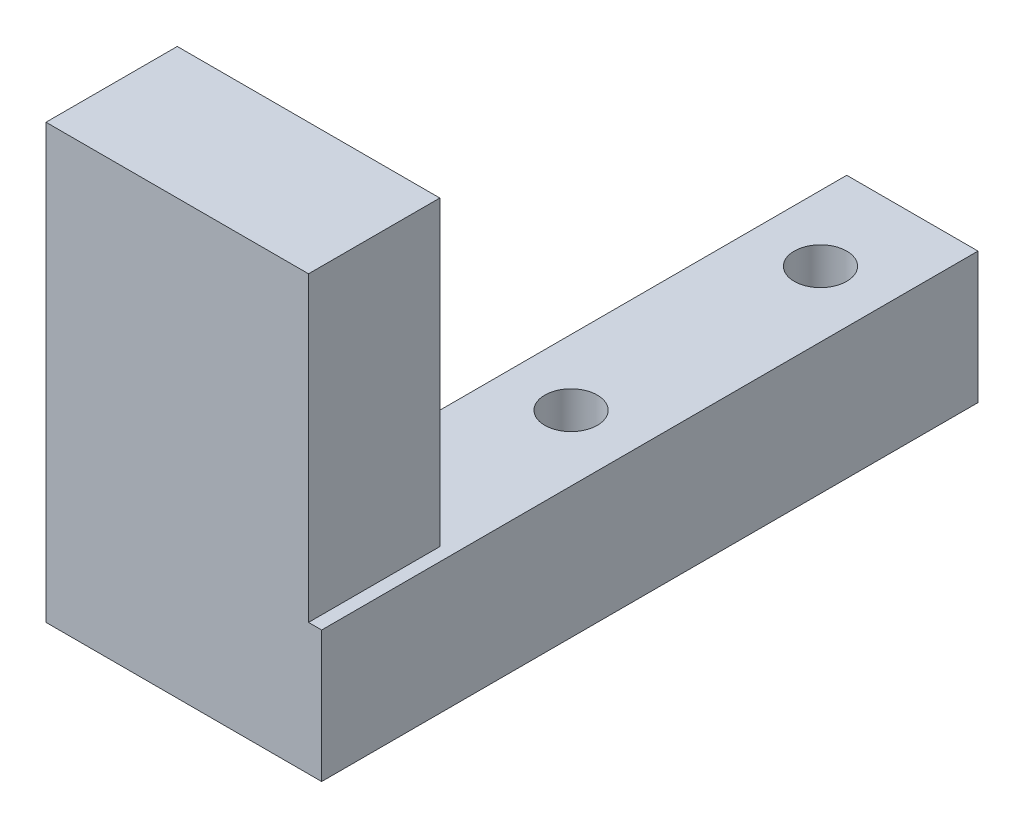
ISO-10303-21;
HEADER;
FILE_DESCRIPTION(('STEP AP214'),'2;1');
FILE_NAME('part.step','',(''),(''),'','','');
FILE_SCHEMA(('AUTOMOTIVE_DESIGN { 1 0 10303 214 1 1 1 1 }'));
ENDSEC;
DATA;
#1=APPLICATION_CONTEXT('core data for automotive mechanical design processes');
#2=APPLICATION_PROTOCOL_DEFINITION('international standard','automotive_design',2000,#1);
#3=PRODUCT_CONTEXT('',#1,'mechanical');
#4=PRODUCT('Part','Part','',(#3));
#5=PRODUCT_RELATED_PRODUCT_CATEGORY('part','',(#4));
#6=PRODUCT_DEFINITION_FORMATION('','',#4);
#7=PRODUCT_DEFINITION_CONTEXT('part definition',#1,'design');
#8=PRODUCT_DEFINITION('design','',#6,#7);
#9=PRODUCT_DEFINITION_SHAPE('','',#8);
#10=(LENGTH_UNIT() NAMED_UNIT(*) SI_UNIT(.MILLI.,.METRE.));
#11=(NAMED_UNIT(*) PLANE_ANGLE_UNIT() SI_UNIT($,.RADIAN.));
#12=(NAMED_UNIT(*) SI_UNIT($,.STERADIAN.) SOLID_ANGLE_UNIT());
#13=UNCERTAINTY_MEASURE_WITH_UNIT(LENGTH_MEASURE(1.E-05),#10,'distance_accuracy_value','');
#14=(GEOMETRIC_REPRESENTATION_CONTEXT(3) GLOBAL_UNCERTAINTY_ASSIGNED_CONTEXT((#13)) GLOBAL_UNIT_ASSIGNED_CONTEXT((#10,
#11,#12)) REPRESENTATION_CONTEXT('',''));
#15=CARTESIAN_POINT('',(0.,0.,0.));
#16=DIRECTION('',(0.,0.,1.));
#17=DIRECTION('',(1.,0.,0.));
#18=AXIS2_PLACEMENT_3D('',#15,#16,#17);
#19=CARTESIAN_POINT('',(-7.85128298838194,3.64329268292683,50.));
#20=DIRECTION('',(0.,-1.,0.));
#21=DIRECTION('',(0.,0.,-1.));
#22=AXIS2_PLACEMENT_3D('',#19,#20,#21);
#23=PLANE('',#22);
#24=CARTESIAN_POINT('',(-2.85128298838193,3.64329268292683,26.));
#25=DIRECTION('',(0.,1.,0.));
#26=DIRECTION('',(0.,0.,1.));
#27=AXIS2_PLACEMENT_3D('',#24,#25,#26);
#28=CIRCLE('',#27,2.);
#29=CARTESIAN_POINT('',(-2.85128298838193,3.64329268292683,28.));
#30=VERTEX_POINT('',#29);
#31=EDGE_CURVE('E207',#30,#30,#28,.T.);
#32=ORIENTED_EDGE('',*,*,#31,.F.);
#33=EDGE_LOOP('',(#32));
#34=FACE_BOUND('',#33,.T.);
#35=CARTESIAN_POINT('',(-2.85128298838194,3.64329268292683,7.));
#36=DIRECTION('',(0.,1.,0.));
#37=DIRECTION('',(0.,0.,1.));
#38=AXIS2_PLACEMENT_3D('',#35,#36,#37);
#39=CIRCLE('',#38,2.);
#40=CARTESIAN_POINT('',(-2.85128298838194,3.64329268292683,9.));
#41=VERTEX_POINT('',#40);
#42=EDGE_CURVE('E130',#41,#41,#39,.T.);
#43=ORIENTED_EDGE('',*,*,#42,.F.);
#44=EDGE_LOOP('',(#43));
#45=FACE_BOUND('',#44,.T.);
#46=DIRECTION('',(-1.,0.,0.));
#47=VECTOR('',#46,1.);
#48=CARTESIAN_POINT('',(-18.8512829883819,3.64329268292683,40.));
#49=LINE('',#48,#47);
#50=CARTESIAN_POINT('',(1.14871701161806,3.64329268292683,40.));
#51=VERTEX_POINT('',#50);
#52=CARTESIAN_POINT('',(-7.85128298838194,3.64329268292683,40.));
#53=VERTEX_POINT('',#52);
#54=EDGE_CURVE('E125',#51,#53,#49,.T.);
#55=ORIENTED_EDGE('',*,*,#54,.F.);
#56=DIRECTION('',(0.,0.,-1.));
#57=VECTOR('',#56,1.);
#58=CARTESIAN_POINT('',(1.14871701161806,3.64329268292683,50.));
#59=LINE('',#58,#57);
#60=CARTESIAN_POINT('',(1.14871701161806,3.64329268292683,50.));
#61=VERTEX_POINT('',#60);
#62=EDGE_CURVE('E51',#61,#51,#59,.T.);
#63=ORIENTED_EDGE('',*,*,#62,.F.);
#64=DIRECTION('',(-1.,0.,0.));
#65=VECTOR('',#64,1.);
#66=CARTESIAN_POINT('',(-7.85128298838194,3.64329268292683,50.));
#67=LINE('',#66,#65);
#68=CARTESIAN_POINT('',(2.14871701161806,3.64329268292683,50.));
#69=VERTEX_POINT('',#68);
#70=EDGE_CURVE('E156',#69,#61,#67,.T.);
#71=ORIENTED_EDGE('',*,*,#70,.F.);
#72=DIRECTION('',(0.,0.,-1.));
#73=VECTOR('',#72,1.);
#74=CARTESIAN_POINT('',(2.14871701161806,3.64329268292683,50.));
#75=LINE('',#74,#73);
#76=CARTESIAN_POINT('',(2.14871701161806,3.64329268292683,0.));
#77=VERTEX_POINT('',#76);
#78=EDGE_CURVE('E173',#69,#77,#75,.T.);
#79=ORIENTED_EDGE('',*,*,#78,.T.);
#80=DIRECTION('',(-1.,0.,0.));
#81=VECTOR('',#80,1.);
#82=CARTESIAN_POINT('',(-7.85128298838194,3.64329268292683,0.));
#83=LINE('',#82,#81);
#84=CARTESIAN_POINT('',(-7.85128298838194,3.64329268292683,0.));
#85=VERTEX_POINT('',#84);
#86=EDGE_CURVE('E169',#77,#85,#83,.T.);
#87=ORIENTED_EDGE('',*,*,#86,.T.);
#88=DIRECTION('',(0.,0.,-1.));
#89=VECTOR('',#88,1.);
#90=CARTESIAN_POINT('',(-7.85128298838194,3.64329268292683,50.));
#91=LINE('',#90,#89);
#92=EDGE_CURVE('E149',#53,#85,#91,.T.);
#93=ORIENTED_EDGE('',*,*,#92,.F.);
#94=EDGE_LOOP('',(#55,#63,#71,#79,#87,#93));
#95=FACE_BOUND('',#94,.T.);
#96=ADVANCED_FACE('F34',(#34,#45,#95),#23,.F.);
#97=CARTESIAN_POINT('',(-7.85128298838194,3.64329268292683,50.));
#98=DIRECTION('',(1.,0.,0.));
#99=DIRECTION('',(0.,1.,0.));
#100=AXIS2_PLACEMENT_3D('',#97,#98,#99);
#101=PLANE('',#100);
#102=DIRECTION('',(0.,-1.,0.));
#103=VECTOR('',#102,1.);
#104=CARTESIAN_POINT('',(-7.85128298838194,3.64329268292683,40.));
#105=LINE('',#104,#103);
#106=CARTESIAN_POINT('',(-7.85128298838193,-6.35670731707317,40.));
#107=VERTEX_POINT('',#106);
#108=EDGE_CURVE('E59',#53,#107,#105,.T.);
#109=ORIENTED_EDGE('',*,*,#108,.F.);
#110=ORIENTED_EDGE('',*,*,#92,.T.);
#111=DIRECTION('',(0.,-1.,0.));
#112=VECTOR('',#111,1.);
#113=CARTESIAN_POINT('',(-7.85128298838194,3.64329268292683,0.));
#114=LINE('',#113,#112);
#115=CARTESIAN_POINT('',(-7.85128298838193,-6.35670731707317,0.));
#116=VERTEX_POINT('',#115);
#117=EDGE_CURVE('E153',#85,#116,#114,.T.);
#118=ORIENTED_EDGE('',*,*,#117,.T.);
#119=DIRECTION('',(0.,0.,-1.));
#120=VECTOR('',#119,1.);
#121=CARTESIAN_POINT('',(-7.85128298838193,-6.35670731707317,50.));
#122=LINE('',#121,#120);
#123=EDGE_CURVE('E11',#107,#116,#122,.T.);
#124=ORIENTED_EDGE('',*,*,#123,.F.);
#125=EDGE_LOOP('',(#109,#110,#118,#124));
#126=FACE_BOUND('',#125,.T.);
#127=ADVANCED_FACE('F36',(#126),#101,.F.);
#128=CARTESIAN_POINT('',(-7.85128298838193,-6.35670731707317,50.));
#129=DIRECTION('',(0.,1.,0.));
#130=DIRECTION('',(0.,0.,1.));
#131=AXIS2_PLACEMENT_3D('',#128,#129,#130);
#132=PLANE('',#131);
#133=CARTESIAN_POINT('',(-2.85128298838193,-6.35670731707317,26.));
#134=DIRECTION('',(0.,1.,0.));
#135=DIRECTION('',(0.,0.,1.));
#136=AXIS2_PLACEMENT_3D('',#133,#134,#135);
#137=CIRCLE('',#136,2.);
#138=CARTESIAN_POINT('',(-2.85128298838193,-6.35670731707317,28.));
#139=VERTEX_POINT('',#138);
#140=EDGE_CURVE('E38',#139,#139,#137,.T.);
#141=ORIENTED_EDGE('',*,*,#140,.T.);
#142=EDGE_LOOP('',(#141));
#143=FACE_BOUND('',#142,.T.);
#144=CARTESIAN_POINT('',(-2.85128298838194,-6.35670731707317,7.));
#145=DIRECTION('',(0.,1.,0.));
#146=DIRECTION('',(0.,0.,1.));
#147=AXIS2_PLACEMENT_3D('',#144,#145,#146);
#148=CIRCLE('',#147,2.);
#149=CARTESIAN_POINT('',(-2.85128298838194,-6.35670731707317,9.));
#150=VERTEX_POINT('',#149);
#151=EDGE_CURVE('E199',#150,#150,#148,.T.);
#152=ORIENTED_EDGE('',*,*,#151,.T.);
#153=EDGE_LOOP('',(#152));
#154=FACE_BOUND('',#153,.T.);
#155=DIRECTION('',(1.,0.,0.));
#156=VECTOR('',#155,1.);
#157=CARTESIAN_POINT('',(-7.85128298838193,-6.35670731707317,0.));
#158=LINE('',#157,#156);
#159=CARTESIAN_POINT('',(2.14871701161806,-6.35670731707317,0.));
#160=VERTEX_POINT('',#159);
#161=EDGE_CURVE('E165',#116,#160,#158,.T.);
#162=ORIENTED_EDGE('',*,*,#161,.T.);
#163=DIRECTION('',(0.,0.,-1.));
#164=VECTOR('',#163,1.);
#165=CARTESIAN_POINT('',(2.14871701161806,-6.35670731707317,50.));
#166=LINE('',#165,#164);
#167=CARTESIAN_POINT('',(2.14871701161806,-6.35670731707317,50.));
#168=VERTEX_POINT('',#167);
#169=EDGE_CURVE('E43',#168,#160,#166,.T.);
#170=ORIENTED_EDGE('',*,*,#169,.F.);
#171=DIRECTION('',(1.,0.,0.));
#172=VECTOR('',#171,1.);
#173=CARTESIAN_POINT('',(-7.85128298838193,-6.35670731707317,50.));
#174=LINE('',#173,#172);
#175=CARTESIAN_POINT('',(-18.8512829883819,-6.35670731707317,50.));
#176=VERTEX_POINT('',#175);
#177=EDGE_CURVE('E144',#176,#168,#174,.T.);
#178=ORIENTED_EDGE('',*,*,#177,.F.);
#179=DIRECTION('',(0.,0.,1.));
#180=VECTOR('',#179,1.);
#181=CARTESIAN_POINT('',(-18.8512829883819,-6.35670731707317,50.));
#182=LINE('',#181,#180);
#183=CARTESIAN_POINT('',(-18.8512829883819,-6.35670731707317,40.));
#184=VERTEX_POINT('',#183);
#185=EDGE_CURVE('E108',#184,#176,#182,.T.);
#186=ORIENTED_EDGE('',*,*,#185,.F.);
#187=DIRECTION('',(1.,0.,0.));
#188=VECTOR('',#187,1.);
#189=CARTESIAN_POINT('',(-18.8512829883819,-6.35670731707317,40.));
#190=LINE('',#189,#188);
#191=EDGE_CURVE('E141',#184,#107,#190,.T.);
#192=ORIENTED_EDGE('',*,*,#191,.T.);
#193=ORIENTED_EDGE('',*,*,#123,.T.);
#194=EDGE_LOOP('',(#162,#170,#178,#186,#192,#193));
#195=FACE_BOUND('',#194,.T.);
#196=ADVANCED_FACE('F222',(#143,#154,#195),#132,.F.);
#197=CARTESIAN_POINT('',(2.14871701161806,3.64329268292683,50.));
#198=DIRECTION('',(-1.,0.,0.));
#199=DIRECTION('',(0.,-1.,0.));
#200=AXIS2_PLACEMENT_3D('',#197,#198,#199);
#201=PLANE('',#200);
#202=DIRECTION('',(0.,1.,0.));
#203=VECTOR('',#202,1.);
#204=CARTESIAN_POINT('',(2.14871701161806,3.64329268292683,0.));
#205=LINE('',#204,#203);
#206=EDGE_CURVE('E167',#160,#77,#205,.T.);
#207=ORIENTED_EDGE('',*,*,#206,.T.);
#208=ORIENTED_EDGE('',*,*,#78,.F.);
#209=DIRECTION('',(0.,1.,0.));
#210=VECTOR('',#209,1.);
#211=CARTESIAN_POINT('',(2.14871701161806,3.64329268292683,50.));
#212=LINE('',#211,#210);
#213=EDGE_CURVE('E159',#168,#69,#212,.T.);
#214=ORIENTED_EDGE('',*,*,#213,.F.);
#215=ORIENTED_EDGE('',*,*,#169,.T.);
#216=EDGE_LOOP('',(#207,#208,#214,#215));
#217=FACE_BOUND('',#216,.T.);
#218=ADVANCED_FACE('F183',(#217),#201,.F.);
#219=CARTESIAN_POINT('',(0.,0.,50.));
#220=DIRECTION('',(0.,0.,1.));
#221=DIRECTION('',(1.,0.,0.));
#222=AXIS2_PLACEMENT_3D('',#219,#220,#221);
#223=PLANE('',#222);
#224=ORIENTED_EDGE('',*,*,#70,.T.);
#225=DIRECTION('',(0.,-1.,0.));
#226=VECTOR('',#225,1.);
#227=CARTESIAN_POINT('',(1.14871701161806,26.6432926829268,50.));
#228=LINE('',#227,#226);
#229=CARTESIAN_POINT('',(1.14871701161806,26.6432926829268,50.));
#230=VERTEX_POINT('',#229);
#231=EDGE_CURVE('E116',#230,#61,#228,.T.);
#232=ORIENTED_EDGE('',*,*,#231,.F.);
#233=DIRECTION('',(1.,0.,0.));
#234=VECTOR('',#233,1.);
#235=CARTESIAN_POINT('',(-18.8512829883819,26.6432926829268,50.));
#236=LINE('',#235,#234);
#237=CARTESIAN_POINT('',(-18.8512829883819,26.6432926829268,50.));
#238=VERTEX_POINT('',#237);
#239=EDGE_CURVE('E113',#238,#230,#236,.T.);
#240=ORIENTED_EDGE('',*,*,#239,.F.);
#241=DIRECTION('',(0.,1.,0.));
#242=VECTOR('',#241,1.);
#243=CARTESIAN_POINT('',(-18.8512829883819,3.64329268292683,50.));
#244=LINE('',#243,#242);
#245=EDGE_CURVE('E102',#176,#238,#244,.T.);
#246=ORIENTED_EDGE('',*,*,#245,.F.);
#247=ORIENTED_EDGE('',*,*,#177,.T.);
#248=ORIENTED_EDGE('',*,*,#213,.T.);
#249=EDGE_LOOP('',(#224,#232,#240,#246,#247,#248));
#250=FACE_BOUND('',#249,.T.);
#251=ADVANCED_FACE('F114',(#250),#223,.T.);
#252=CARTESIAN_POINT('',(0.,0.,0.));
#253=DIRECTION('',(0.,0.,1.));
#254=DIRECTION('',(1.,0.,0.));
#255=AXIS2_PLACEMENT_3D('',#252,#253,#254);
#256=PLANE('',#255);
#257=ORIENTED_EDGE('',*,*,#117,.F.);
#258=ORIENTED_EDGE('',*,*,#86,.F.);
#259=ORIENTED_EDGE('',*,*,#206,.F.);
#260=ORIENTED_EDGE('',*,*,#161,.F.);
#261=EDGE_LOOP('',(#257,#258,#259,#260));
#262=FACE_BOUND('',#261,.T.);
#263=ADVANCED_FACE('F190',(#262),#256,.F.);
#264=CARTESIAN_POINT('',(-18.8512829883819,3.64329268292682,40.));
#265=DIRECTION('',(0.,0.,1.));
#266=DIRECTION('',(1.,0.,0.));
#267=AXIS2_PLACEMENT_3D('',#264,#265,#266);
#268=PLANE('',#267);
#269=ORIENTED_EDGE('',*,*,#108,.T.);
#270=ORIENTED_EDGE('',*,*,#191,.F.);
#271=DIRECTION('',(0.,-1.,0.));
#272=VECTOR('',#271,1.);
#273=CARTESIAN_POINT('',(-18.8512829883819,3.64329268292682,40.));
#274=LINE('',#273,#272);
#275=CARTESIAN_POINT('',(-18.8512829883819,26.6432926829268,40.));
#276=VERTEX_POINT('',#275);
#277=EDGE_CURVE('E110',#276,#184,#274,.T.);
#278=ORIENTED_EDGE('',*,*,#277,.F.);
#279=DIRECTION('',(-1.,0.,0.));
#280=VECTOR('',#279,1.);
#281=CARTESIAN_POINT('',(-18.8512829883819,26.6432926829268,40.));
#282=LINE('',#281,#280);
#283=CARTESIAN_POINT('',(1.14871701161806,26.6432926829268,40.));
#284=VERTEX_POINT('',#283);
#285=EDGE_CURVE('E124',#284,#276,#282,.T.);
#286=ORIENTED_EDGE('',*,*,#285,.F.);
#287=DIRECTION('',(0.,-1.,0.));
#288=VECTOR('',#287,1.);
#289=CARTESIAN_POINT('',(1.14871701161806,26.6432926829268,40.));
#290=LINE('',#289,#288);
#291=EDGE_CURVE('E135',#284,#51,#290,.T.);
#292=ORIENTED_EDGE('',*,*,#291,.T.);
#293=ORIENTED_EDGE('',*,*,#54,.T.);
#294=EDGE_LOOP('',(#269,#270,#278,#286,#292,#293));
#295=FACE_BOUND('',#294,.T.);
#296=ADVANCED_FACE('F232',(#295),#268,.F.);
#297=CARTESIAN_POINT('',(-18.8512829883819,0.,0.));
#298=DIRECTION('',(1.,0.,0.));
#299=DIRECTION('',(0.,1.,0.));
#300=AXIS2_PLACEMENT_3D('',#297,#298,#299);
#301=PLANE('',#300);
#302=ORIENTED_EDGE('',*,*,#245,.T.);
#303=DIRECTION('',(0.,0.,1.));
#304=VECTOR('',#303,1.);
#305=CARTESIAN_POINT('',(-18.8512829883819,26.6432926829268,50.));
#306=LINE('',#305,#304);
#307=EDGE_CURVE('E106',#276,#238,#306,.T.);
#308=ORIENTED_EDGE('',*,*,#307,.F.);
#309=ORIENTED_EDGE('',*,*,#277,.T.);
#310=ORIENTED_EDGE('',*,*,#185,.T.);
#311=EDGE_LOOP('',(#302,#308,#309,#310));
#312=FACE_BOUND('',#311,.T.);
#313=ADVANCED_FACE('F104',(#312),#301,.F.);
#314=CARTESIAN_POINT('',(1.14871701161806,26.6432926829268,50.));
#315=DIRECTION('',(-1.,0.,0.));
#316=DIRECTION('',(0.,0.,1.));
#317=AXIS2_PLACEMENT_3D('',#314,#315,#316);
#318=PLANE('',#317);
#319=ORIENTED_EDGE('',*,*,#62,.T.);
#320=ORIENTED_EDGE('',*,*,#291,.F.);
#321=DIRECTION('',(0.,0.,-1.));
#322=VECTOR('',#321,1.);
#323=CARTESIAN_POINT('',(1.14871701161806,26.6432926829268,50.));
#324=LINE('',#323,#322);
#325=EDGE_CURVE('E119',#230,#284,#324,.T.);
#326=ORIENTED_EDGE('',*,*,#325,.F.);
#327=ORIENTED_EDGE('',*,*,#231,.T.);
#328=EDGE_LOOP('',(#319,#320,#326,#327));
#329=FACE_BOUND('',#328,.T.);
#330=ADVANCED_FACE('F192',(#329),#318,.F.);
#331=CARTESIAN_POINT('',(0.,26.6432926829268,0.));
#332=DIRECTION('',(0.,-1.,0.));
#333=DIRECTION('',(0.,0.,-1.));
#334=AXIS2_PLACEMENT_3D('',#331,#332,#333);
#335=PLANE('',#334);
#336=ORIENTED_EDGE('',*,*,#307,.T.);
#337=ORIENTED_EDGE('',*,*,#239,.T.);
#338=ORIENTED_EDGE('',*,*,#325,.T.);
#339=ORIENTED_EDGE('',*,*,#285,.T.);
#340=EDGE_LOOP('',(#336,#337,#338,#339));
#341=FACE_BOUND('',#340,.T.);
#342=ADVANCED_FACE('F122',(#341),#335,.F.);
#343=CARTESIAN_POINT('',(-2.85128298838194,-19.3567073170732,7.));
#344=DIRECTION('',(0.,1.,0.));
#345=DIRECTION('',(0.,0.,1.));
#346=AXIS2_PLACEMENT_3D('',#343,#344,#345);
#347=CYLINDRICAL_SURFACE('',#346,2.);
#348=ORIENTED_EDGE('',*,*,#42,.T.);
#349=EDGE_LOOP('',(#348));
#350=FACE_BOUND('',#349,.T.);
#351=ORIENTED_EDGE('',*,*,#151,.F.);
#352=EDGE_LOOP('',(#351));
#353=FACE_BOUND('',#352,.T.);
#354=ADVANCED_FACE('F300',(#350,#353),#347,.F.);
#355=CARTESIAN_POINT('',(-2.85128298838193,-19.3567073170732,26.));
#356=DIRECTION('',(0.,1.,0.));
#357=DIRECTION('',(0.,0.,1.));
#358=AXIS2_PLACEMENT_3D('',#355,#356,#357);
#359=CYLINDRICAL_SURFACE('',#358,2.);
#360=ORIENTED_EDGE('',*,*,#31,.T.);
#361=EDGE_LOOP('',(#360));
#362=FACE_BOUND('',#361,.T.);
#363=ORIENTED_EDGE('',*,*,#140,.F.);
#364=EDGE_LOOP('',(#363));
#365=FACE_BOUND('',#364,.T.);
#366=ADVANCED_FACE('F213',(#362,#365),#359,.F.);
#367=CLOSED_SHELL('',(#96,#127,#196,#218,#251,#263,#296,#313,#330,#342,#354,#366));
#368=MANIFOLD_SOLID_BREP('B2',#367);
#369=ADVANCED_BREP_SHAPE_REPRESENTATION('',(#18,#368),#14);
#370=SHAPE_DEFINITION_REPRESENTATION(#9,#369);
ENDSEC;
END-ISO-10303-21;
